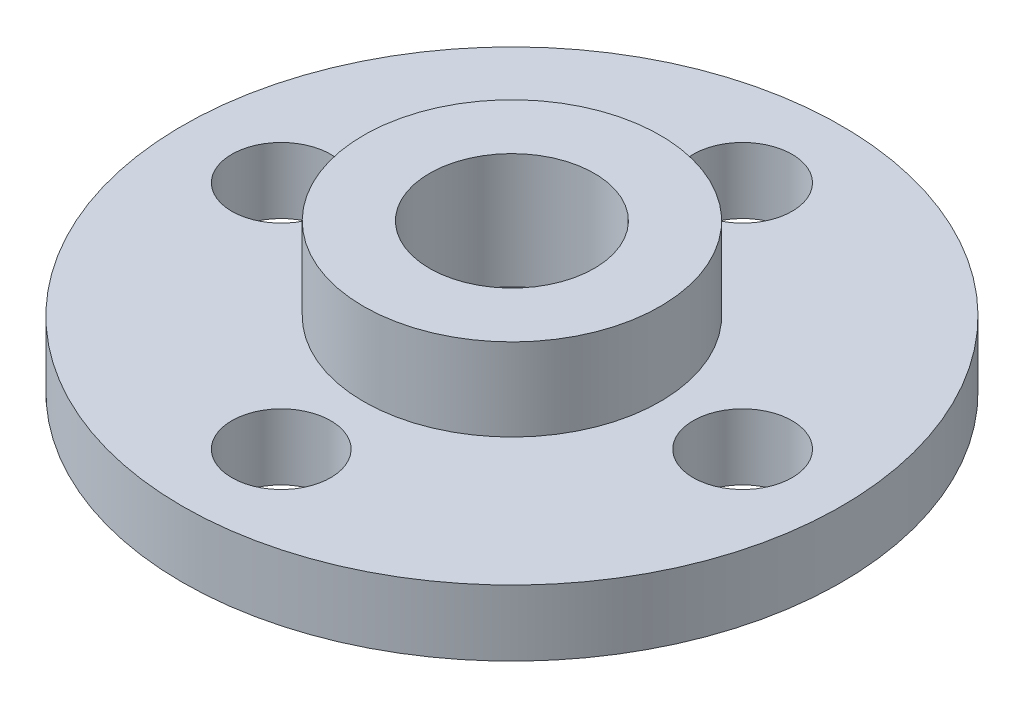
ISO-10303-21;
HEADER;
FILE_DESCRIPTION(('STEP AP214'),'2;1');
FILE_NAME('part.step','',(''),(''),'','','');
FILE_SCHEMA(('AUTOMOTIVE_DESIGN { 1 0 10303 214 1 1 1 1 }'));
ENDSEC;
DATA;
#1=APPLICATION_CONTEXT('core data for automotive mechanical design processes');
#2=APPLICATION_PROTOCOL_DEFINITION('international standard','automotive_design',2000,#1);
#3=PRODUCT_CONTEXT('',#1,'mechanical');
#4=PRODUCT('Part','Part','',(#3));
#5=PRODUCT_RELATED_PRODUCT_CATEGORY('part','',(#4));
#6=PRODUCT_DEFINITION_FORMATION('','',#4);
#7=PRODUCT_DEFINITION_CONTEXT('part definition',#1,'design');
#8=PRODUCT_DEFINITION('design','',#6,#7);
#9=PRODUCT_DEFINITION_SHAPE('','',#8);
#10=(LENGTH_UNIT() NAMED_UNIT(*) SI_UNIT(.MILLI.,.METRE.));
#11=(NAMED_UNIT(*) PLANE_ANGLE_UNIT() SI_UNIT($,.RADIAN.));
#12=(NAMED_UNIT(*) SI_UNIT($,.STERADIAN.) SOLID_ANGLE_UNIT());
#13=UNCERTAINTY_MEASURE_WITH_UNIT(LENGTH_MEASURE(1.E-05),#10,'distance_accuracy_value','');
#14=(GEOMETRIC_REPRESENTATION_CONTEXT(3) GLOBAL_UNCERTAINTY_ASSIGNED_CONTEXT((#13)) GLOBAL_UNIT_ASSIGNED_CONTEXT((#10,
#11,#12)) REPRESENTATION_CONTEXT('',''));
#15=CARTESIAN_POINT('',(0.,0.,0.));
#16=DIRECTION('',(0.,0.,1.));
#17=DIRECTION('',(1.,0.,0.));
#18=AXIS2_PLACEMENT_3D('',#15,#16,#17);
#19=CARTESIAN_POINT('',(0.,0.,0.));
#20=DIRECTION('',(0.,1.,0.));
#21=DIRECTION('',(0.,0.,1.));
#22=AXIS2_PLACEMENT_3D('',#19,#20,#21);
#23=CYLINDRICAL_SURFACE('',#22,1.5);
#24=CARTESIAN_POINT('',(0.,0.,0.));
#25=DIRECTION('',(0.,1.,0.));
#26=DIRECTION('',(0.,0.,1.));
#27=AXIS2_PLACEMENT_3D('',#24,#25,#26);
#28=CIRCLE('',#27,1.5);
#29=CARTESIAN_POINT('',(0.,0.,1.5));
#30=VERTEX_POINT('',#29);
#31=EDGE_CURVE('E75',#30,#30,#28,.T.);
#32=ORIENTED_EDGE('',*,*,#31,.F.);
#33=EDGE_LOOP('',(#32));
#34=FACE_BOUND('',#33,.T.);
#35=CARTESIAN_POINT('',(0.,1.,0.));
#36=DIRECTION('',(0.,1.,0.));
#37=DIRECTION('',(0.,0.,1.));
#38=AXIS2_PLACEMENT_3D('',#35,#36,#37);
#39=CIRCLE('',#38,1.5);
#40=CARTESIAN_POINT('',(0.,1.,1.5));
#41=VERTEX_POINT('',#40);
#42=EDGE_CURVE('E37',#41,#41,#39,.F.);
#43=ORIENTED_EDGE('',*,*,#42,.F.);
#44=EDGE_LOOP('',(#43));
#45=FACE_BOUND('',#44,.T.);
#46=ADVANCED_FACE('F33',(#34,#45),#23,.F.);
#47=CARTESIAN_POINT('',(0.,2.,0.));
#48=DIRECTION('',(0.,1.,0.));
#49=DIRECTION('',(0.,0.,1.));
#50=AXIS2_PLACEMENT_3D('',#47,#48,#49);
#51=PLANE('',#50);
#52=CARTESIAN_POINT('',(0.,2.,0.));
#53=DIRECTION('',(0.,1.,0.));
#54=DIRECTION('',(0.,0.,1.));
#55=AXIS2_PLACEMENT_3D('',#52,#53,#54);
#56=CIRCLE('',#55,4.5);
#57=CARTESIAN_POINT('',(0.,2.,4.5));
#58=VERTEX_POINT('',#57);
#59=EDGE_CURVE('E72',#58,#58,#56,.T.);
#60=ORIENTED_EDGE('',*,*,#59,.F.);
#61=EDGE_LOOP('',(#60));
#62=FACE_BOUND('',#61,.T.);
#63=CARTESIAN_POINT('',(3.9618942650685E-13,2.,7.));
#64=DIRECTION('',(0.,1.,0.));
#65=DIRECTION('',(0.,0.,1.));
#66=AXIS2_PLACEMENT_3D('',#63,#64,#65);
#67=CIRCLE('',#66,1.50000000000043);
#68=CARTESIAN_POINT('',(3.9618942650685E-13,2.,8.50000000000043));
#69=VERTEX_POINT('',#68);
#70=EDGE_CURVE('E57',#69,#69,#67,.T.);
#71=ORIENTED_EDGE('',*,*,#70,.F.);
#72=EDGE_LOOP('',(#71));
#73=FACE_BOUND('',#72,.T.);
#74=CARTESIAN_POINT('',(0.,2.,-7.));
#75=DIRECTION('',(0.,1.,0.));
#76=DIRECTION('',(0.,0.,1.));
#77=AXIS2_PLACEMENT_3D('',#74,#75,#76);
#78=CIRCLE('',#77,1.5);
#79=CARTESIAN_POINT('',(0.,2.,-5.5));
#80=VERTEX_POINT('',#79);
#81=EDGE_CURVE('E46',#80,#80,#78,.T.);
#82=ORIENTED_EDGE('',*,*,#81,.F.);
#83=EDGE_LOOP('',(#82));
#84=FACE_BOUND('',#83,.T.);
#85=CARTESIAN_POINT('',(0.,2.,0.));
#86=DIRECTION('',(0.,1.,0.));
#87=DIRECTION('',(0.,0.,1.));
#88=AXIS2_PLACEMENT_3D('',#85,#86,#87);
#89=CIRCLE('',#88,10.);
#90=CARTESIAN_POINT('',(0.,2.,10.));
#91=VERTEX_POINT('',#90);
#92=EDGE_CURVE('E10',#91,#91,#89,.T.);
#93=ORIENTED_EDGE('',*,*,#92,.T.);
#94=EDGE_LOOP('',(#93));
#95=FACE_BOUND('',#94,.T.);
#96=CARTESIAN_POINT('',(7.0000000000002,2.,-1.98094713253425E-13));
#97=DIRECTION('',(0.,1.,0.));
#98=DIRECTION('',(0.,0.,1.));
#99=AXIS2_PLACEMENT_3D('',#96,#97,#98);
#100=CIRCLE('',#99,1.50000000000016);
#101=CARTESIAN_POINT('',(7.0000000000002,2.,1.49999999999996));
#102=VERTEX_POINT('',#101);
#103=EDGE_CURVE('E51',#102,#102,#100,.T.);
#104=ORIENTED_EDGE('',*,*,#103,.F.);
#105=EDGE_LOOP('',(#104));
#106=FACE_BOUND('',#105,.T.);
#107=CARTESIAN_POINT('',(-6.9999999999998,2.,1.98951966012828E-13));
#108=DIRECTION('',(0.,1.,0.));
#109=DIRECTION('',(0.,0.,1.));
#110=AXIS2_PLACEMENT_3D('',#107,#108,#109);
#111=CIRCLE('',#110,1.50000000000032);
#112=CARTESIAN_POINT('',(-6.9999999999998,2.,1.50000000000052));
#113=VERTEX_POINT('',#112);
#114=EDGE_CURVE('E63',#113,#113,#111,.T.);
#115=ORIENTED_EDGE('',*,*,#114,.F.);
#116=EDGE_LOOP('',(#115));
#117=FACE_BOUND('',#116,.T.);
#118=ADVANCED_FACE('F93',(#62,#73,#84,#95,#106,#117),#51,.T.);
#119=CARTESIAN_POINT('',(0.,0.,0.));
#120=DIRECTION('',(0.,1.,0.));
#121=DIRECTION('',(0.,0.,1.));
#122=AXIS2_PLACEMENT_3D('',#119,#120,#121);
#123=PLANE('',#122);
#124=ORIENTED_EDGE('',*,*,#31,.T.);
#125=EDGE_LOOP('',(#124));
#126=FACE_BOUND('',#125,.T.);
#127=CARTESIAN_POINT('',(0.,0.,0.));
#128=DIRECTION('',(0.,1.,0.));
#129=DIRECTION('',(0.,0.,1.));
#130=AXIS2_PLACEMENT_3D('',#127,#128,#129);
#131=CIRCLE('',#130,10.);
#132=CARTESIAN_POINT('',(0.,0.,10.));
#133=VERTEX_POINT('',#132);
#134=EDGE_CURVE('E41',#133,#133,#131,.T.);
#135=ORIENTED_EDGE('',*,*,#134,.F.);
#136=EDGE_LOOP('',(#135));
#137=FACE_BOUND('',#136,.T.);
#138=CARTESIAN_POINT('',(0.,0.,-7.));
#139=DIRECTION('',(0.,1.,0.));
#140=DIRECTION('',(0.,0.,1.));
#141=AXIS2_PLACEMENT_3D('',#138,#139,#140);
#142=CIRCLE('',#141,1.5);
#143=CARTESIAN_POINT('',(0.,0.,-5.5));
#144=VERTEX_POINT('',#143);
#145=EDGE_CURVE('E48',#144,#144,#142,.T.);
#146=ORIENTED_EDGE('',*,*,#145,.T.);
#147=EDGE_LOOP('',(#146));
#148=FACE_BOUND('',#147,.T.);
#149=CARTESIAN_POINT('',(7.0000000000002,0.,-1.98094713253425E-13));
#150=DIRECTION('',(0.,1.,0.));
#151=DIRECTION('',(0.,0.,1.));
#152=AXIS2_PLACEMENT_3D('',#149,#150,#151);
#153=CIRCLE('',#152,1.50000000000016);
#154=CARTESIAN_POINT('',(7.0000000000002,0.,1.49999999999996));
#155=VERTEX_POINT('',#154);
#156=EDGE_CURVE('E54',#155,#155,#153,.T.);
#157=ORIENTED_EDGE('',*,*,#156,.T.);
#158=EDGE_LOOP('',(#157));
#159=FACE_BOUND('',#158,.T.);
#160=CARTESIAN_POINT('',(3.9618942650685E-13,0.,7.));
#161=DIRECTION('',(0.,1.,0.));
#162=DIRECTION('',(0.,0.,1.));
#163=AXIS2_PLACEMENT_3D('',#160,#161,#162);
#164=CIRCLE('',#163,1.50000000000043);
#165=CARTESIAN_POINT('',(3.9618942650685E-13,0.,8.50000000000043));
#166=VERTEX_POINT('',#165);
#167=EDGE_CURVE('E60',#166,#166,#164,.T.);
#168=ORIENTED_EDGE('',*,*,#167,.T.);
#169=EDGE_LOOP('',(#168));
#170=FACE_BOUND('',#169,.T.);
#171=CARTESIAN_POINT('',(-6.9999999999998,0.,1.98951966012828E-13));
#172=DIRECTION('',(0.,1.,0.));
#173=DIRECTION('',(0.,0.,1.));
#174=AXIS2_PLACEMENT_3D('',#171,#172,#173);
#175=CIRCLE('',#174,1.50000000000032);
#176=CARTESIAN_POINT('',(-6.9999999999998,0.,1.50000000000052));
#177=VERTEX_POINT('',#176);
#178=EDGE_CURVE('E66',#177,#177,#175,.T.);
#179=ORIENTED_EDGE('',*,*,#178,.T.);
#180=EDGE_LOOP('',(#179));
#181=FACE_BOUND('',#180,.T.);
#182=ADVANCED_FACE('F99',(#126,#137,#148,#159,#170,#181),#123,.F.);
#183=CARTESIAN_POINT('',(0.,2.,0.));
#184=DIRECTION('',(0.,-1.,0.));
#185=DIRECTION('',(0.,0.,-1.));
#186=AXIS2_PLACEMENT_3D('',#183,#184,#185);
#187=CYLINDRICAL_SURFACE('',#186,10.);
#188=ORIENTED_EDGE('',*,*,#92,.F.);
#189=EDGE_LOOP('',(#188));
#190=FACE_BOUND('',#189,.T.);
#191=ORIENTED_EDGE('',*,*,#134,.T.);
#192=EDGE_LOOP('',(#191));
#193=FACE_BOUND('',#192,.T.);
#194=ADVANCED_FACE('F35',(#190,#193),#187,.T.);
#195=CARTESIAN_POINT('',(0.,2.,-7.));
#196=DIRECTION('',(0.,-1.,0.));
#197=DIRECTION('',(0.,0.,-1.));
#198=AXIS2_PLACEMENT_3D('',#195,#196,#197);
#199=CYLINDRICAL_SURFACE('',#198,1.5);
#200=ORIENTED_EDGE('',*,*,#81,.T.);
#201=EDGE_LOOP('',(#200));
#202=FACE_BOUND('',#201,.T.);
#203=ORIENTED_EDGE('',*,*,#145,.F.);
#204=EDGE_LOOP('',(#203));
#205=FACE_BOUND('',#204,.T.);
#206=ADVANCED_FACE('F126',(#202,#205),#199,.F.);
#207=CARTESIAN_POINT('',(7.0000000000002,2.,-1.98094713253425E-13));
#208=DIRECTION('',(0.,-1.,0.));
#209=DIRECTION('',(0.,0.,-1.));
#210=AXIS2_PLACEMENT_3D('',#207,#208,#209);
#211=CYLINDRICAL_SURFACE('',#210,1.50000000000016);
#212=ORIENTED_EDGE('',*,*,#103,.T.);
#213=EDGE_LOOP('',(#212));
#214=FACE_BOUND('',#213,.T.);
#215=ORIENTED_EDGE('',*,*,#156,.F.);
#216=EDGE_LOOP('',(#215));
#217=FACE_BOUND('',#216,.T.);
#218=ADVANCED_FACE('F122',(#214,#217),#211,.F.);
#219=CARTESIAN_POINT('',(3.9618942650685E-13,2.,7.));
#220=DIRECTION('',(0.,-1.,0.));
#221=DIRECTION('',(0.,0.,-1.));
#222=AXIS2_PLACEMENT_3D('',#219,#220,#221);
#223=CYLINDRICAL_SURFACE('',#222,1.50000000000043);
#224=ORIENTED_EDGE('',*,*,#70,.T.);
#225=EDGE_LOOP('',(#224));
#226=FACE_BOUND('',#225,.T.);
#227=ORIENTED_EDGE('',*,*,#167,.F.);
#228=EDGE_LOOP('',(#227));
#229=FACE_BOUND('',#228,.T.);
#230=ADVANCED_FACE('F118',(#226,#229),#223,.F.);
#231=CARTESIAN_POINT('',(-6.9999999999998,2.,1.98951966012828E-13));
#232=DIRECTION('',(0.,-1.,0.));
#233=DIRECTION('',(0.,0.,-1.));
#234=AXIS2_PLACEMENT_3D('',#231,#232,#233);
#235=CYLINDRICAL_SURFACE('',#234,1.50000000000032);
#236=ORIENTED_EDGE('',*,*,#114,.T.);
#237=EDGE_LOOP('',(#236));
#238=FACE_BOUND('',#237,.T.);
#239=ORIENTED_EDGE('',*,*,#178,.F.);
#240=EDGE_LOOP('',(#239));
#241=FACE_BOUND('',#240,.T.);
#242=ADVANCED_FACE('F114',(#238,#241),#235,.F.);
#243=CARTESIAN_POINT('',(0.,4.5,0.));
#244=DIRECTION('',(0.,-1.,0.));
#245=DIRECTION('',(0.,0.,-1.));
#246=AXIS2_PLACEMENT_3D('',#243,#244,#245);
#247=CYLINDRICAL_SURFACE('',#246,4.5);
#248=CARTESIAN_POINT('',(0.,4.5,0.));
#249=DIRECTION('',(0.,1.,0.));
#250=DIRECTION('',(0.,0.,1.));
#251=AXIS2_PLACEMENT_3D('',#248,#249,#250);
#252=CIRCLE('',#251,4.5);
#253=CARTESIAN_POINT('',(0.,4.5,4.5));
#254=VERTEX_POINT('',#253);
#255=EDGE_CURVE('E69',#254,#254,#252,.T.);
#256=ORIENTED_EDGE('',*,*,#255,.F.);
#257=EDGE_LOOP('',(#256));
#258=FACE_BOUND('',#257,.T.);
#259=ORIENTED_EDGE('',*,*,#59,.T.);
#260=EDGE_LOOP('',(#259));
#261=FACE_BOUND('',#260,.T.);
#262=ADVANCED_FACE('F110',(#258,#261),#247,.T.);
#263=CARTESIAN_POINT('',(0.,4.5,0.));
#264=DIRECTION('',(0.,1.,0.));
#265=DIRECTION('',(0.,0.,1.));
#266=AXIS2_PLACEMENT_3D('',#263,#264,#265);
#267=PLANE('',#266);
#268=CARTESIAN_POINT('',(0.,4.5,0.));
#269=DIRECTION('',(0.,1.,0.));
#270=DIRECTION('',(0.,0.,1.));
#271=AXIS2_PLACEMENT_3D('',#268,#269,#270);
#272=CIRCLE('',#271,2.5);
#273=CARTESIAN_POINT('',(0.,4.5,2.5));
#274=VERTEX_POINT('',#273);
#275=EDGE_CURVE('E80',#274,#274,#272,.T.);
#276=ORIENTED_EDGE('',*,*,#275,.F.);
#277=EDGE_LOOP('',(#276));
#278=FACE_BOUND('',#277,.T.);
#279=ORIENTED_EDGE('',*,*,#255,.T.);
#280=EDGE_LOOP('',(#279));
#281=FACE_BOUND('',#280,.T.);
#282=ADVANCED_FACE('F107',(#278,#281),#267,.T.);
#283=CARTESIAN_POINT('',(0.,1.,0.));
#284=DIRECTION('',(0.,1.,0.));
#285=DIRECTION('',(0.,0.,1.));
#286=AXIS2_PLACEMENT_3D('',#283,#284,#285);
#287=PLANE('',#286);
#288=CARTESIAN_POINT('',(0.,1.,0.));
#289=DIRECTION('',(0.,1.,0.));
#290=DIRECTION('',(0.,0.,1.));
#291=AXIS2_PLACEMENT_3D('',#288,#289,#290);
#292=CIRCLE('',#291,2.5);
#293=CARTESIAN_POINT('',(0.,1.,2.5));
#294=VERTEX_POINT('',#293);
#295=EDGE_CURVE('E83',#294,#294,#292,.T.);
#296=ORIENTED_EDGE('',*,*,#295,.T.);
#297=EDGE_LOOP('',(#296));
#298=FACE_BOUND('',#297,.T.);
#299=ORIENTED_EDGE('',*,*,#42,.T.);
#300=EDGE_LOOP('',(#299));
#301=FACE_BOUND('',#300,.T.);
#302=ADVANCED_FACE('F90',(#298,#301),#287,.T.);
#303=CARTESIAN_POINT('',(0.,1.,0.));
#304=DIRECTION('',(0.,1.,0.));
#305=DIRECTION('',(0.,0.,1.));
#306=AXIS2_PLACEMENT_3D('',#303,#304,#305);
#307=CYLINDRICAL_SURFACE('',#306,2.5);
#308=ORIENTED_EDGE('',*,*,#295,.F.);
#309=EDGE_LOOP('',(#308));
#310=FACE_BOUND('',#309,.T.);
#311=ORIENTED_EDGE('',*,*,#275,.T.);
#312=EDGE_LOOP('',(#311));
#313=FACE_BOUND('',#312,.T.);
#314=ADVANCED_FACE('F105',(#310,#313),#307,.F.);
#315=CLOSED_SHELL('',(#46,#118,#182,#194,#206,#218,#230,#242,#262,#282,#302,#314));
#316=MANIFOLD_SOLID_BREP('B2',#315);
#317=ADVANCED_BREP_SHAPE_REPRESENTATION('',(#18,#316),#14);
#318=SHAPE_DEFINITION_REPRESENTATION(#9,#317);
ENDSEC;
END-ISO-10303-21;
